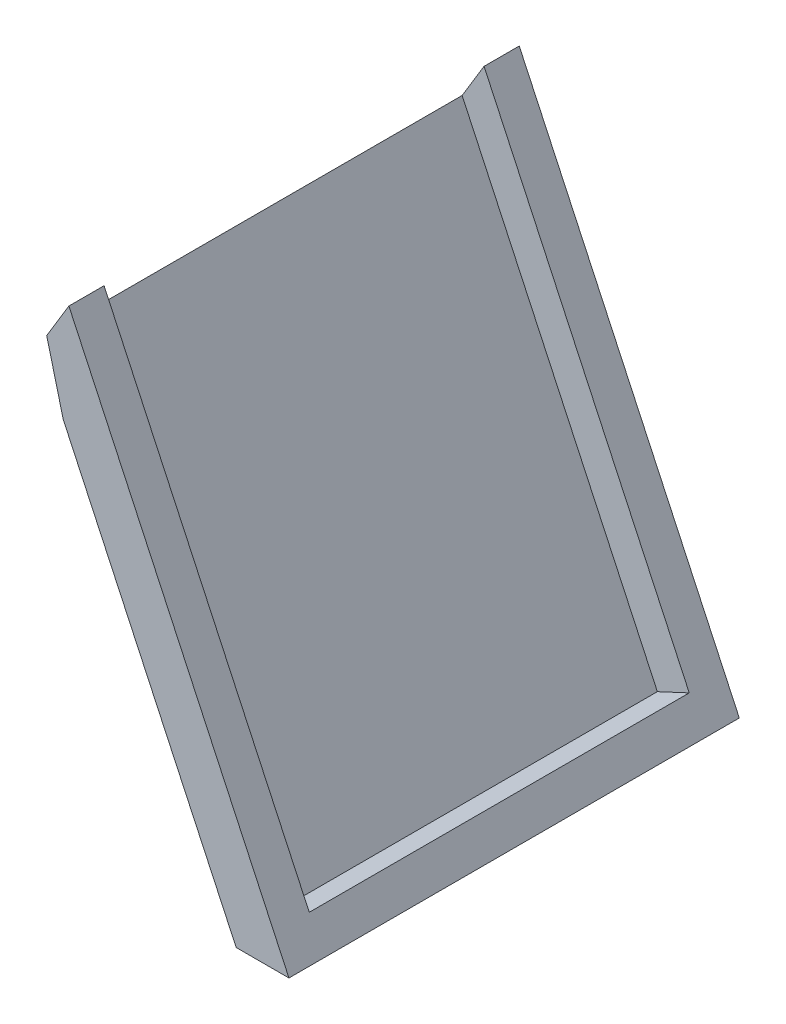
ISO-10303-21;
HEADER;
FILE_DESCRIPTION(('STEP AP214'),'2;1');
FILE_NAME('part.step','',(''),(''),'','','');
FILE_SCHEMA(('AUTOMOTIVE_DESIGN { 1 0 10303 214 1 1 1 1 }'));
ENDSEC;
DATA;
#1=APPLICATION_CONTEXT('core data for automotive mechanical design processes');
#2=APPLICATION_PROTOCOL_DEFINITION('international standard','automotive_design',2000,#1);
#3=PRODUCT_CONTEXT('',#1,'mechanical');
#4=PRODUCT('Part','Part','',(#3));
#5=PRODUCT_RELATED_PRODUCT_CATEGORY('part','',(#4));
#6=PRODUCT_DEFINITION_FORMATION('','',#4);
#7=PRODUCT_DEFINITION_CONTEXT('part definition',#1,'design');
#8=PRODUCT_DEFINITION('design','',#6,#7);
#9=PRODUCT_DEFINITION_SHAPE('','',#8);
#10=(LENGTH_UNIT() NAMED_UNIT(*) SI_UNIT(.MILLI.,.METRE.));
#11=(NAMED_UNIT(*) PLANE_ANGLE_UNIT() SI_UNIT($,.RADIAN.));
#12=(NAMED_UNIT(*) SI_UNIT($,.STERADIAN.) SOLID_ANGLE_UNIT());
#13=UNCERTAINTY_MEASURE_WITH_UNIT(LENGTH_MEASURE(1.E-05),#10,'distance_accuracy_value','');
#14=(GEOMETRIC_REPRESENTATION_CONTEXT(3) GLOBAL_UNCERTAINTY_ASSIGNED_CONTEXT((#13)) GLOBAL_UNIT_ASSIGNED_CONTEXT((#10,
#11,#12)) REPRESENTATION_CONTEXT('',''));
#15=CARTESIAN_POINT('',(0.,0.,0.));
#16=DIRECTION('',(0.,0.,1.));
#17=DIRECTION('',(1.,0.,0.));
#18=AXIS2_PLACEMENT_3D('',#15,#16,#17);
#19=CARTESIAN_POINT('',(-23.7737513688121,67.0667762407119,-64.));
#20=DIRECTION('',(-0.855287603364558,0.518153563657445,0.));
#21=DIRECTION('',(-0.518153563657446,-0.855287603364558,0.));
#22=AXIS2_PLACEMENT_3D('',#19,#20,#21);
#23=PLANE('',#22);
#24=DIRECTION('',(0.,0.,-1.));
#25=VECTOR('',#24,1.);
#26=CARTESIAN_POINT('',(-26.8911516936594,61.9210548955833,-64.));
#27=LINE('',#26,#25);
#28=CARTESIAN_POINT('',(-26.8911516936594,61.9210548955833,-5.));
#29=VERTEX_POINT('',#28);
#30=CARTESIAN_POINT('',(-26.8911516936594,61.9210548955833,-59.));
#31=VERTEX_POINT('',#30);
#32=EDGE_CURVE('E11',#29,#31,#27,.T.);
#33=ORIENTED_EDGE('',*,*,#32,.T.);
#34=DIRECTION('',(0.518153563657446,0.855287603364558,0.));
#35=VECTOR('',#34,1.);
#36=CARTESIAN_POINT('',(-23.7737513688121,67.0667762407119,-59.));
#37=LINE('',#36,#35);
#38=CARTESIAN_POINT('',(-23.7737513688121,67.0667762407119,-59.));
#39=VERTEX_POINT('',#38);
#40=EDGE_CURVE('E173',#31,#39,#37,.T.);
#41=ORIENTED_EDGE('',*,*,#40,.T.);
#42=DIRECTION('',(0.,0.,1.));
#43=VECTOR('',#42,1.);
#44=CARTESIAN_POINT('',(-23.7737513688121,67.0667762407119,-64.));
#45=LINE('',#44,#43);
#46=CARTESIAN_POINT('',(-23.7737513688121,67.0667762407119,-64.));
#47=VERTEX_POINT('',#46);
#48=EDGE_CURVE('E262',#47,#39,#45,.T.);
#49=ORIENTED_EDGE('',*,*,#48,.F.);
#50=DIRECTION('',(-0.518153563657445,-0.855287603364558,0.));
#51=VECTOR('',#50,1.);
#52=CARTESIAN_POINT('',(-23.7737513688121,67.0667762407119,-64.));
#53=LINE('',#52,#51);
#54=CARTESIAN_POINT('',(-26.9272910442205,61.8614016562803,-64.));
#55=VERTEX_POINT('',#54);
#56=EDGE_CURVE('E237',#47,#55,#53,.T.);
#57=ORIENTED_EDGE('',*,*,#56,.T.);
#58=DIRECTION('',(0.,0.,1.));
#59=VECTOR('',#58,1.);
#60=CARTESIAN_POINT('',(-26.9272910442205,61.8614016562803,-64.));
#61=LINE('',#60,#59);
#62=CARTESIAN_POINT('',(-26.9272910442205,61.8614016562803,0.));
#63=VERTEX_POINT('',#62);
#64=EDGE_CURVE('E48',#55,#63,#61,.T.);
#65=ORIENTED_EDGE('',*,*,#64,.T.);
#66=DIRECTION('',(-0.518153563657445,-0.855287603364558,0.));
#67=VECTOR('',#66,1.);
#68=CARTESIAN_POINT('',(-23.7737513688121,67.0667762407119,0.));
#69=LINE('',#68,#67);
#70=CARTESIAN_POINT('',(-23.7737513688121,67.0667762407119,0.));
#71=VERTEX_POINT('',#70);
#72=EDGE_CURVE('E225',#71,#63,#69,.T.);
#73=ORIENTED_EDGE('',*,*,#72,.F.);
#74=CARTESIAN_POINT('',(-23.7737513688121,67.0667762407119,-5.));
#75=VERTEX_POINT('',#74);
#76=EDGE_CURVE('E266',#75,#71,#45,.T.);
#77=ORIENTED_EDGE('',*,*,#76,.F.);
#78=DIRECTION('',(0.518153563657446,0.855287603364558,0.));
#79=VECTOR('',#78,1.);
#80=CARTESIAN_POINT('',(-23.7737513688121,67.0667762407119,-5.));
#81=LINE('',#80,#79);
#82=EDGE_CURVE('E55',#29,#75,#81,.T.);
#83=ORIENTED_EDGE('',*,*,#82,.F.);
#84=EDGE_LOOP('',(#33,#41,#49,#57,#65,#73,#77,#83));
#85=FACE_BOUND('',#84,.T.);
#86=ADVANCED_FACE('F39',(#85),#23,.T.);
#87=CARTESIAN_POINT('',(7.5,0.,-64.));
#88=DIRECTION('',(0.906307787036648,0.422618261740704,0.));
#89=DIRECTION('',(-0.422618261740704,0.906307787036648,0.));
#90=AXIS2_PLACEMENT_3D('',#87,#88,#89);
#91=PLANE('',#90);
#92=ORIENTED_EDGE('',*,*,#48,.T.);
#93=DIRECTION('',(0.422618261740704,-0.906307787036648,0.));
#94=VECTOR('',#93,1.);
#95=CARTESIAN_POINT('',(6.16045353632449,2.8726666616962,-59.));
#96=LINE('',#95,#94);
#97=CARTESIAN_POINT('',(5.38690869129648,4.53153893518323,-59.));
#98=VERTEX_POINT('',#97);
#99=EDGE_CURVE('E160',#39,#98,#96,.T.);
#100=ORIENTED_EDGE('',*,*,#99,.T.);
#101=DIRECTION('',(0.,0.,-1.));
#102=VECTOR('',#101,1.);
#103=CARTESIAN_POINT('',(5.38690869129648,4.53153893518323,0.));
#104=LINE('',#103,#102);
#105=CARTESIAN_POINT('',(5.38690869129648,4.53153893518324,-5.00000000000001));
#106=VERTEX_POINT('',#105);
#107=EDGE_CURVE('E166',#106,#98,#104,.T.);
#108=ORIENTED_EDGE('',*,*,#107,.F.);
#109=DIRECTION('',(0.422618261740704,-0.906307787036648,0.));
#110=VECTOR('',#109,1.);
#111=CARTESIAN_POINT('',(6.16045353632449,2.87266666169619,-5.00000000000001));
#112=LINE('',#111,#110);
#113=EDGE_CURVE('E147',#75,#106,#112,.T.);
#114=ORIENTED_EDGE('',*,*,#113,.F.);
#115=ORIENTED_EDGE('',*,*,#76,.T.);
#116=DIRECTION('',(-0.422618261740704,0.906307787036648,0.));
#117=VECTOR('',#116,1.);
#118=CARTESIAN_POINT('',(7.5,0.,0.));
#119=LINE('',#118,#117);
#120=CARTESIAN_POINT('',(7.5,0.,0.));
#121=VERTEX_POINT('',#120);
#122=EDGE_CURVE('E253',#121,#71,#119,.T.);
#123=ORIENTED_EDGE('',*,*,#122,.F.);
#124=DIRECTION('',(0.,0.,1.));
#125=VECTOR('',#124,1.);
#126=CARTESIAN_POINT('',(7.5,0.,-64.));
#127=LINE('',#126,#125);
#128=CARTESIAN_POINT('',(7.5,0.,-64.));
#129=VERTEX_POINT('',#128);
#130=EDGE_CURVE('E267',#129,#121,#127,.T.);
#131=ORIENTED_EDGE('',*,*,#130,.F.);
#132=DIRECTION('',(-0.422618261740704,0.906307787036648,0.));
#133=VECTOR('',#132,1.);
#134=CARTESIAN_POINT('',(7.5,0.,-64.));
#135=LINE('',#134,#133);
#136=EDGE_CURVE('E233',#129,#47,#135,.T.);
#137=ORIENTED_EDGE('',*,*,#136,.T.);
#138=EDGE_LOOP('',(#92,#100,#108,#114,#115,#123,#131,#137));
#139=FACE_BOUND('',#138,.T.);
#140=ADVANCED_FACE('F321',(#139),#91,.T.);
#141=CARTESIAN_POINT('',(-26.9272910442205,61.8614016562803,-64.));
#142=DIRECTION('',(-0.968631035351248,-0.248503354815119,0.));
#143=DIRECTION('',(0.248503354815119,-0.968631035351248,0.));
#144=AXIS2_PLACEMENT_3D('',#141,#142,#143);
#145=PLANE('',#144);
#146=DIRECTION('',(-0.24850335481512,0.968631035351248,0.));
#147=VECTOR('',#146,1.);
#148=CARTESIAN_POINT('',(-24.5799931253107,52.7119653633054,-28.));
#149=LINE('',#148,#147);
#150=CARTESIAN_POINT('',(-24.5799931253107,52.7119653633054,-28.));
#151=VERTEX_POINT('',#150);
#152=CARTESIAN_POINT('',(-25.3255031897561,55.6178584693592,-28.));
#153=VERTEX_POINT('',#152);
#154=EDGE_CURVE('E177',#151,#153,#149,.T.);
#155=ORIENTED_EDGE('',*,*,#154,.F.);
#156=DIRECTION('',(0.,0.,1.));
#157=VECTOR('',#156,1.);
#158=CARTESIAN_POINT('',(-24.5799931253107,52.7119653633054,-64.));
#159=LINE('',#158,#157);
#160=CARTESIAN_POINT('',(-24.5799931253107,52.7119653633054,0.));
#161=VERTEX_POINT('',#160);
#162=EDGE_CURVE('E241',#151,#161,#159,.T.);
#163=ORIENTED_EDGE('',*,*,#162,.T.);
#164=DIRECTION('',(0.248503354815119,-0.968631035351248,0.));
#165=VECTOR('',#164,1.);
#166=CARTESIAN_POINT('',(-26.9272910442205,61.8614016562803,0.));
#167=LINE('',#166,#165);
#168=EDGE_CURVE('E219',#63,#161,#167,.T.);
#169=ORIENTED_EDGE('',*,*,#168,.F.);
#170=ORIENTED_EDGE('',*,*,#64,.F.);
#171=DIRECTION('',(0.248503354815119,-0.968631035351248,0.));
#172=VECTOR('',#171,1.);
#173=CARTESIAN_POINT('',(-26.9272910442205,61.8614016562803,-64.));
#174=LINE('',#173,#172);
#175=CARTESIAN_POINT('',(-24.5799931253107,52.7119653633054,-64.));
#176=VERTEX_POINT('',#175);
#177=EDGE_CURVE('E220',#55,#176,#174,.T.);
#178=ORIENTED_EDGE('',*,*,#177,.T.);
#179=CARTESIAN_POINT('',(-24.5799931253107,52.7119653633054,-36.));
#180=VERTEX_POINT('',#179);
#181=EDGE_CURVE('E272',#176,#180,#159,.T.);
#182=ORIENTED_EDGE('',*,*,#181,.T.);
#183=DIRECTION('',(0.24850335481512,-0.968631035351248,0.));
#184=VECTOR('',#183,1.);
#185=CARTESIAN_POINT('',(-25.3255031897561,55.6178584693592,-36.));
#186=LINE('',#185,#184);
#187=CARTESIAN_POINT('',(-25.3255031897561,55.6178584693592,-36.));
#188=VERTEX_POINT('',#187);
#189=EDGE_CURVE('E198',#188,#180,#186,.T.);
#190=ORIENTED_EDGE('',*,*,#189,.F.);
#191=DIRECTION('',(0.,0.,-1.));
#192=VECTOR('',#191,1.);
#193=CARTESIAN_POINT('',(-25.3255031897561,55.6178584693592,-28.));
#194=LINE('',#193,#192);
#195=EDGE_CURVE('E63',#153,#188,#194,.T.);
#196=ORIENTED_EDGE('',*,*,#195,.F.);
#197=EDGE_LOOP('',(#155,#163,#169,#170,#178,#182,#190,#196));
#198=FACE_BOUND('',#197,.T.);
#199=ADVANCED_FACE('F41',(#198),#145,.T.);
#200=CARTESIAN_POINT('',(0.,0.,-64.));
#201=DIRECTION('',(0.,-1.,0.));
#202=DIRECTION('',(0.,0.,-1.));
#203=AXIS2_PLACEMENT_3D('',#200,#201,#202);
#204=PLANE('',#203);
#205=DIRECTION('',(1.,0.,0.));
#206=VECTOR('',#205,1.);
#207=CARTESIAN_POINT('',(0.,0.,0.));
#208=LINE('',#207,#206);
#209=CARTESIAN_POINT('',(0.,0.,0.));
#210=VERTEX_POINT('',#209);
#211=EDGE_CURVE('E249',#210,#121,#208,.T.);
#212=ORIENTED_EDGE('',*,*,#211,.F.);
#213=DIRECTION('',(0.,0.,1.));
#214=VECTOR('',#213,1.);
#215=CARTESIAN_POINT('',(0.,0.,-64.));
#216=LINE('',#215,#214);
#217=CARTESIAN_POINT('',(0.,0.,-64.));
#218=VERTEX_POINT('',#217);
#219=EDGE_CURVE('E270',#218,#210,#216,.T.);
#220=ORIENTED_EDGE('',*,*,#219,.F.);
#221=DIRECTION('',(1.,0.,0.));
#222=VECTOR('',#221,1.);
#223=CARTESIAN_POINT('',(0.,0.,-64.));
#224=LINE('',#223,#222);
#225=EDGE_CURVE('E229',#218,#129,#224,.T.);
#226=ORIENTED_EDGE('',*,*,#225,.T.);
#227=ORIENTED_EDGE('',*,*,#130,.T.);
#228=EDGE_LOOP('',(#212,#220,#226,#227));
#229=FACE_BOUND('',#228,.T.);
#230=ADVANCED_FACE('F331',(#229),#204,.T.);
#231=CARTESIAN_POINT('',(-24.5799931253107,52.7119653633054,-64.));
#232=DIRECTION('',(-0.906307787036648,-0.422618261740704,0.));
#233=DIRECTION('',(0.422618261740704,-0.906307787036648,0.));
#234=AXIS2_PLACEMENT_3D('',#231,#232,#233);
#235=PLANE('',#234);
#236=DIRECTION('',(0.422618261740704,-0.906307787036648,0.));
#237=VECTOR('',#236,1.);
#238=CARTESIAN_POINT('',(-24.5799931253107,52.7119653633054,0.));
#239=LINE('',#238,#237);
#240=EDGE_CURVE('E245',#161,#210,#239,.T.);
#241=ORIENTED_EDGE('',*,*,#240,.F.);
#242=ORIENTED_EDGE('',*,*,#162,.F.);
#243=DIRECTION('',(0.,0.,1.));
#244=VECTOR('',#243,1.);
#245=CARTESIAN_POINT('',(-24.5799931253107,52.7119653633054,-32.));
#246=LINE('',#245,#244);
#247=EDGE_CURVE('E183',#180,#151,#246,.T.);
#248=ORIENTED_EDGE('',*,*,#247,.F.);
#249=ORIENTED_EDGE('',*,*,#181,.F.);
#250=DIRECTION('',(0.422618261740704,-0.906307787036648,0.));
#251=VECTOR('',#250,1.);
#252=CARTESIAN_POINT('',(-24.5799931253107,52.7119653633054,-64.));
#253=LINE('',#252,#251);
#254=EDGE_CURVE('E224',#176,#218,#253,.T.);
#255=ORIENTED_EDGE('',*,*,#254,.T.);
#256=ORIENTED_EDGE('',*,*,#219,.T.);
#257=EDGE_LOOP('',(#241,#242,#248,#249,#255,#256));
#258=FACE_BOUND('',#257,.T.);
#259=ADVANCED_FACE('F280',(#258),#235,.T.);
#260=CARTESIAN_POINT('',(0.,0.,-64.));
#261=DIRECTION('',(0.,0.,1.));
#262=DIRECTION('',(1.,0.,0.));
#263=AXIS2_PLACEMENT_3D('',#260,#261,#262);
#264=PLANE('',#263);
#265=ORIENTED_EDGE('',*,*,#177,.F.);
#266=ORIENTED_EDGE('',*,*,#56,.F.);
#267=ORIENTED_EDGE('',*,*,#136,.F.);
#268=ORIENTED_EDGE('',*,*,#225,.F.);
#269=ORIENTED_EDGE('',*,*,#254,.F.);
#270=EDGE_LOOP('',(#265,#266,#267,#268,#269));
#271=FACE_BOUND('',#270,.T.);
#272=ADVANCED_FACE('F292',(#271),#264,.F.);
#273=CARTESIAN_POINT('',(0.,0.,0.));
#274=DIRECTION('',(0.,0.,1.));
#275=DIRECTION('',(1.,0.,0.));
#276=AXIS2_PLACEMENT_3D('',#273,#274,#275);
#277=PLANE('',#276);
#278=ORIENTED_EDGE('',*,*,#168,.T.);
#279=ORIENTED_EDGE('',*,*,#240,.T.);
#280=ORIENTED_EDGE('',*,*,#211,.T.);
#281=ORIENTED_EDGE('',*,*,#122,.T.);
#282=ORIENTED_EDGE('',*,*,#72,.T.);
#283=EDGE_LOOP('',(#278,#279,#280,#281,#282));
#284=FACE_BOUND('',#283,.T.);
#285=ADVANCED_FACE('F283',(#284),#277,.T.);
#286=CARTESIAN_POINT('',(-28.4545172667157,51.717951944045,-28.));
#287=DIRECTION('',(0.,0.,-1.));
#288=DIRECTION('',(-1.,0.,0.));
#289=AXIS2_PLACEMENT_3D('',#286,#287,#288);
#290=PLANE('',#289);
#291=ORIENTED_EDGE('',*,*,#154,.T.);
#292=DIRECTION('',(0.968631035351248,0.248503354815119,0.));
#293=VECTOR('',#292,1.);
#294=CARTESIAN_POINT('',(-29.2000273311611,54.6238450500987,-28.));
#295=LINE('',#294,#293);
#296=CARTESIAN_POINT('',(-29.2000273311611,54.6238450500987,-28.));
#297=VERTEX_POINT('',#296);
#298=EDGE_CURVE('E216',#297,#153,#295,.T.);
#299=ORIENTED_EDGE('',*,*,#298,.F.);
#300=DIRECTION('',(-0.24850335481512,0.968631035351248,0.));
#301=VECTOR('',#300,1.);
#302=CARTESIAN_POINT('',(-28.4545172667157,51.717951944045,-28.));
#303=LINE('',#302,#301);
#304=CARTESIAN_POINT('',(-28.4545172667157,51.717951944045,-28.));
#305=VERTEX_POINT('',#304);
#306=EDGE_CURVE('E178',#305,#297,#303,.T.);
#307=ORIENTED_EDGE('',*,*,#306,.F.);
#308=DIRECTION('',(0.968631035351248,0.248503354815119,0.));
#309=VECTOR('',#308,1.);
#310=CARTESIAN_POINT('',(-28.4545172667157,51.717951944045,-28.));
#311=LINE('',#310,#309);
#312=EDGE_CURVE('E192',#305,#151,#311,.T.);
#313=ORIENTED_EDGE('',*,*,#312,.T.);
#314=EDGE_LOOP('',(#291,#299,#307,#313));
#315=FACE_BOUND('',#314,.T.);
#316=ADVANCED_FACE('F302',(#315),#290,.F.);
#317=CARTESIAN_POINT('',(-29.2000273311611,54.6238450500987,-28.));
#318=DIRECTION('',(0.248503354815119,-0.968631035351248,0.));
#319=DIRECTION('',(0.968631035351248,0.248503354815119,0.));
#320=AXIS2_PLACEMENT_3D('',#317,#318,#319);
#321=PLANE('',#320);
#322=ORIENTED_EDGE('',*,*,#195,.T.);
#323=DIRECTION('',(0.968631035351248,0.248503354815119,0.));
#324=VECTOR('',#323,1.);
#325=CARTESIAN_POINT('',(-29.2000273311611,54.6238450500987,-36.));
#326=LINE('',#325,#324);
#327=CARTESIAN_POINT('',(-29.2000273311611,54.6238450500987,-36.));
#328=VERTEX_POINT('',#327);
#329=EDGE_CURVE('E212',#328,#188,#326,.T.);
#330=ORIENTED_EDGE('',*,*,#329,.F.);
#331=DIRECTION('',(0.,0.,-1.));
#332=VECTOR('',#331,1.);
#333=CARTESIAN_POINT('',(-29.2000273311611,54.6238450500987,-28.));
#334=LINE('',#333,#332);
#335=EDGE_CURVE('E182',#297,#328,#334,.T.);
#336=ORIENTED_EDGE('',*,*,#335,.F.);
#337=ORIENTED_EDGE('',*,*,#298,.T.);
#338=EDGE_LOOP('',(#322,#330,#336,#337));
#339=FACE_BOUND('',#338,.T.);
#340=ADVANCED_FACE('F311',(#339),#321,.F.);
#341=CARTESIAN_POINT('',(-29.2000273311611,54.6238450500987,-36.));
#342=DIRECTION('',(0.,0.,1.));
#343=DIRECTION('',(1.,0.,0.));
#344=AXIS2_PLACEMENT_3D('',#341,#342,#343);
#345=PLANE('',#344);
#346=ORIENTED_EDGE('',*,*,#189,.T.);
#347=DIRECTION('',(0.968631035351248,0.248503354815119,0.));
#348=VECTOR('',#347,1.);
#349=CARTESIAN_POINT('',(-28.4545172667157,51.717951944045,-36.));
#350=LINE('',#349,#348);
#351=CARTESIAN_POINT('',(-28.4545172667157,51.717951944045,-36.));
#352=VERTEX_POINT('',#351);
#353=EDGE_CURVE('E208',#352,#180,#350,.T.);
#354=ORIENTED_EDGE('',*,*,#353,.F.);
#355=DIRECTION('',(0.24850335481512,-0.968631035351248,0.));
#356=VECTOR('',#355,1.);
#357=CARTESIAN_POINT('',(-29.2000273311611,54.6238450500987,-36.));
#358=LINE('',#357,#356);
#359=EDGE_CURVE('E186',#328,#352,#358,.T.);
#360=ORIENTED_EDGE('',*,*,#359,.F.);
#361=ORIENTED_EDGE('',*,*,#329,.T.);
#362=EDGE_LOOP('',(#346,#354,#360,#361));
#363=FACE_BOUND('',#362,.T.);
#364=ADVANCED_FACE('F309',(#363),#345,.F.);
#365=CARTESIAN_POINT('',(-28.4545172667157,51.717951944045,-32.));
#366=DIRECTION('',(-0.248503354815119,0.968631035351248,0.));
#367=DIRECTION('',(-0.968631035351248,-0.248503354815119,0.));
#368=AXIS2_PLACEMENT_3D('',#365,#366,#367);
#369=PLANE('',#368);
#370=ORIENTED_EDGE('',*,*,#247,.T.);
#371=ORIENTED_EDGE('',*,*,#312,.F.);
#372=DIRECTION('',(0.,0.,1.));
#373=VECTOR('',#372,1.);
#374=CARTESIAN_POINT('',(-28.4545172667157,51.717951944045,-36.));
#375=LINE('',#374,#373);
#376=EDGE_CURVE('E189',#352,#305,#375,.T.);
#377=ORIENTED_EDGE('',*,*,#376,.F.);
#378=ORIENTED_EDGE('',*,*,#353,.T.);
#379=EDGE_LOOP('',(#370,#371,#377,#378));
#380=FACE_BOUND('',#379,.T.);
#381=ADVANCED_FACE('F297',(#380),#369,.F.);
#382=CARTESIAN_POINT('',(-14.2484113831025,-3.65544557242371,0.));
#383=DIRECTION('',(-0.968631035351248,-0.24850335481512,0.));
#384=DIRECTION('',(0.24850335481512,-0.968631035351248,0.));
#385=AXIS2_PLACEMENT_3D('',#382,#383,#384);
#386=PLANE('',#385);
#387=ORIENTED_EDGE('',*,*,#306,.T.);
#388=ORIENTED_EDGE('',*,*,#335,.T.);
#389=ORIENTED_EDGE('',*,*,#359,.T.);
#390=ORIENTED_EDGE('',*,*,#376,.T.);
#391=EDGE_LOOP('',(#387,#388,#389,#390));
#392=FACE_BOUND('',#391,.T.);
#393=ADVANCED_FACE('F305',(#392),#386,.T.);
#394=CARTESIAN_POINT('',(1.62891460114125,0.759575352992677,-59.));
#395=DIRECTION('',(0.,0.,1.));
#396=DIRECTION('',(0.,-1.,0.));
#397=AXIS2_PLACEMENT_3D('',#394,#395,#396);
#398=PLANE('',#397);
#399=DIRECTION('',(0.422618261740704,-0.906307787036648,0.));
#400=VECTOR('',#399,1.);
#401=CARTESIAN_POINT('',(1.62891460114125,0.759575352992677,-59.));
#402=LINE('',#401,#400);
#403=CARTESIAN_POINT('',(0.855369756113241,2.41844762647971,-59.));
#404=VERTEX_POINT('',#403);
#405=EDGE_CURVE('E143',#31,#404,#402,.T.);
#406=ORIENTED_EDGE('',*,*,#405,.T.);
#407=DIRECTION('',(0.906307787036648,0.422618261740704,0.));
#408=VECTOR('',#407,1.);
#409=CARTESIAN_POINT('',(0.855369756113241,2.41844762647971,-59.));
#410=LINE('',#409,#408);
#411=EDGE_CURVE('E152',#404,#98,#410,.T.);
#412=ORIENTED_EDGE('',*,*,#411,.T.);
#413=ORIENTED_EDGE('',*,*,#99,.F.);
#414=ORIENTED_EDGE('',*,*,#40,.F.);
#415=EDGE_LOOP('',(#406,#412,#413,#414));
#416=FACE_BOUND('',#415,.T.);
#417=ADVANCED_FACE('F377',(#416),#398,.T.);
#418=CARTESIAN_POINT('',(0.855369756113241,2.41844762647971,0.));
#419=DIRECTION('',(0.422618261740704,-0.906307787036648,0.));
#420=DIRECTION('',(0.906307787036648,0.422618261740704,0.));
#421=AXIS2_PLACEMENT_3D('',#418,#419,#420);
#422=PLANE('',#421);
#423=ORIENTED_EDGE('',*,*,#107,.T.);
#424=ORIENTED_EDGE('',*,*,#411,.F.);
#425=DIRECTION('',(0.,0.,-1.));
#426=VECTOR('',#425,1.);
#427=CARTESIAN_POINT('',(0.855369756113241,2.41844762647971,0.));
#428=LINE('',#427,#426);
#429=CARTESIAN_POINT('',(0.855369756113246,2.41844762647971,-5.00000000000001));
#430=VERTEX_POINT('',#429);
#431=EDGE_CURVE('E141',#430,#404,#428,.T.);
#432=ORIENTED_EDGE('',*,*,#431,.F.);
#433=DIRECTION('',(0.906307787036648,0.422618261740704,0.));
#434=VECTOR('',#433,1.);
#435=CARTESIAN_POINT('',(0.855369756113246,2.41844762647971,-5.00000000000001));
#436=LINE('',#435,#434);
#437=EDGE_CURVE('E145',#430,#106,#436,.T.);
#438=ORIENTED_EDGE('',*,*,#437,.T.);
#439=EDGE_LOOP('',(#423,#424,#432,#438));
#440=FACE_BOUND('',#439,.T.);
#441=ADVANCED_FACE('F155',(#440),#422,.F.);
#442=CARTESIAN_POINT('',(1.62891460114125,0.759575352992672,-5.00000000000001));
#443=DIRECTION('',(0.,0.,1.));
#444=DIRECTION('',(0.,-1.,0.));
#445=AXIS2_PLACEMENT_3D('',#442,#443,#444);
#446=PLANE('',#445);
#447=ORIENTED_EDGE('',*,*,#82,.T.);
#448=ORIENTED_EDGE('',*,*,#113,.T.);
#449=ORIENTED_EDGE('',*,*,#437,.F.);
#450=DIRECTION('',(0.422618261740704,-0.906307787036648,0.));
#451=VECTOR('',#450,1.);
#452=CARTESIAN_POINT('',(1.62891460114125,0.759575352992672,-5.00000000000001));
#453=LINE('',#452,#451);
#454=EDGE_CURVE('E136',#29,#430,#453,.T.);
#455=ORIENTED_EDGE('',*,*,#454,.F.);
#456=EDGE_LOOP('',(#447,#448,#449,#455));
#457=FACE_BOUND('',#456,.T.);
#458=ADVANCED_FACE('F146',(#457),#446,.F.);
#459=CARTESIAN_POINT('',(1.62891460114125,0.759575352992672,0.));
#460=DIRECTION('',(0.906307787036648,0.422618261740704,0.));
#461=DIRECTION('',(-0.422618261740704,0.906307787036648,0.));
#462=AXIS2_PLACEMENT_3D('',#459,#460,#461);
#463=PLANE('',#462);
#464=ORIENTED_EDGE('',*,*,#454,.T.);
#465=ORIENTED_EDGE('',*,*,#431,.T.);
#466=ORIENTED_EDGE('',*,*,#405,.F.);
#467=ORIENTED_EDGE('',*,*,#32,.F.);
#468=EDGE_LOOP('',(#464,#465,#466,#467));
#469=FACE_BOUND('',#468,.T.);
#470=ADVANCED_FACE('F138',(#469),#463,.T.);
#471=CLOSED_SHELL('',(#86,#140,#199,#230,#259,#272,#285,#316,#340,#364,#381,#393,#417,#441,#458,#470));
#472=MANIFOLD_SOLID_BREP('B2',#471);
#473=ADVANCED_BREP_SHAPE_REPRESENTATION('',(#18,#472),#14);
#474=SHAPE_DEFINITION_REPRESENTATION(#9,#473);
ENDSEC;
END-ISO-10303-21;
